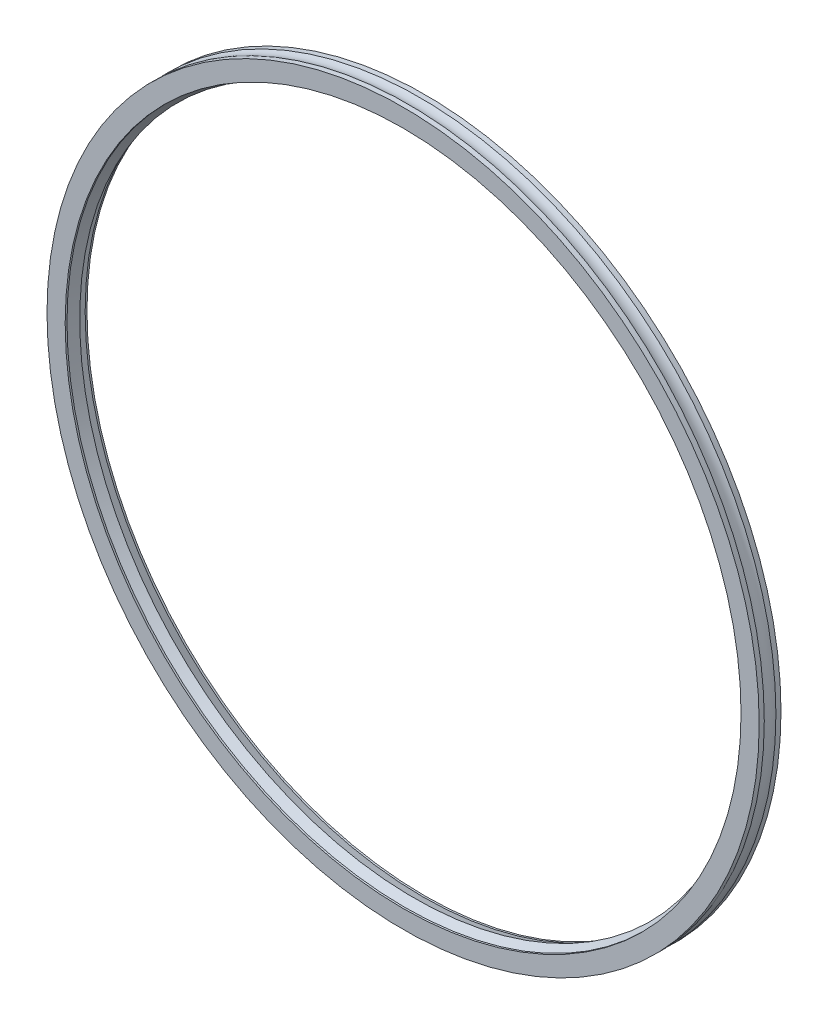
ISO-10303-21;
HEADER;
FILE_DESCRIPTION(('STEP AP214'),'2;1');
FILE_NAME('part.step','',(''),(''),'','','');
FILE_SCHEMA(('AUTOMOTIVE_DESIGN { 1 0 10303 214 1 1 1 1 }'));
ENDSEC;
DATA;
#1=APPLICATION_CONTEXT('core data for automotive mechanical design processes');
#2=APPLICATION_PROTOCOL_DEFINITION('international standard','automotive_design',2000,#1);
#3=PRODUCT_CONTEXT('',#1,'mechanical');
#4=PRODUCT('Part','Part','',(#3));
#5=PRODUCT_RELATED_PRODUCT_CATEGORY('part','',(#4));
#6=PRODUCT_DEFINITION_FORMATION('','',#4);
#7=PRODUCT_DEFINITION_CONTEXT('part definition',#1,'design');
#8=PRODUCT_DEFINITION('design','',#6,#7);
#9=PRODUCT_DEFINITION_SHAPE('','',#8);
#10=(LENGTH_UNIT() NAMED_UNIT(*) SI_UNIT(.MILLI.,.METRE.));
#11=(NAMED_UNIT(*) PLANE_ANGLE_UNIT() SI_UNIT($,.RADIAN.));
#12=(NAMED_UNIT(*) SI_UNIT($,.STERADIAN.) SOLID_ANGLE_UNIT());
#13=UNCERTAINTY_MEASURE_WITH_UNIT(LENGTH_MEASURE(1.E-05),#10,'distance_accuracy_value','');
#14=(GEOMETRIC_REPRESENTATION_CONTEXT(3) GLOBAL_UNCERTAINTY_ASSIGNED_CONTEXT((#13)) GLOBAL_UNIT_ASSIGNED_CONTEXT((#10,
#11,#12)) REPRESENTATION_CONTEXT('',''));
#15=CARTESIAN_POINT('',(0.,0.,0.));
#16=DIRECTION('',(0.,0.,1.));
#17=DIRECTION('',(1.,0.,0.));
#18=AXIS2_PLACEMENT_3D('',#15,#16,#17);
#19=CARTESIAN_POINT('',(0.,0.,0.));
#20=DIRECTION('',(0.,0.,1.));
#21=DIRECTION('',(1.,0.,0.));
#22=AXIS2_PLACEMENT_3D('',#19,#20,#21);
#23=TOROIDAL_SURFACE('',#22,50.8330302779823,2.);
#24=CARTESIAN_POINT('',(0.,0.,0.8));
#25=DIRECTION('',(0.,0.,1.));
#26=DIRECTION('',(1.,0.,0.));
#27=AXIS2_PLACEMENT_3D('',#24,#25,#26);
#28=CIRCLE('',#27,49.);
#29=CARTESIAN_POINT('',(49.,0.,0.8));
#30=VERTEX_POINT('',#29);
#31=EDGE_CURVE('E10',#30,#30,#28,.T.);
#32=ORIENTED_EDGE('',*,*,#31,.F.);
#33=EDGE_LOOP('',(#32));
#34=FACE_BOUND('',#33,.T.);
#35=CARTESIAN_POINT('',(0.,0.,-0.8));
#36=DIRECTION('',(0.,0.,1.));
#37=DIRECTION('',(1.,0.,0.));
#38=AXIS2_PLACEMENT_3D('',#35,#36,#37);
#39=CIRCLE('',#38,49.);
#40=CARTESIAN_POINT('',(49.,0.,-0.8));
#41=VERTEX_POINT('',#40);
#42=EDGE_CURVE('E68',#41,#41,#39,.T.);
#43=ORIENTED_EDGE('',*,*,#42,.T.);
#44=EDGE_LOOP('',(#43));
#45=FACE_BOUND('',#44,.T.);
#46=ADVANCED_FACE('F37',(#34,#45),#23,.F.);
#47=CARTESIAN_POINT('',(0.,0.,0.));
#48=DIRECTION('',(0.,0.,1.));
#49=DIRECTION('',(1.,0.,0.));
#50=AXIS2_PLACEMENT_3D('',#47,#48,#49);
#51=CYLINDRICAL_SURFACE('',#50,49.);
#52=CARTESIAN_POINT('',(0.,0.,1.5));
#53=DIRECTION('',(0.,0.,1.));
#54=DIRECTION('',(1.,0.,0.));
#55=AXIS2_PLACEMENT_3D('',#52,#53,#54);
#56=CIRCLE('',#55,49.);
#57=CARTESIAN_POINT('',(49.,0.,1.5));
#58=VERTEX_POINT('',#57);
#59=EDGE_CURVE('E43',#58,#58,#56,.T.);
#60=ORIENTED_EDGE('',*,*,#59,.F.);
#61=EDGE_LOOP('',(#60));
#62=FACE_BOUND('',#61,.T.);
#63=ORIENTED_EDGE('',*,*,#31,.T.);
#64=EDGE_LOOP('',(#63));
#65=FACE_BOUND('',#64,.T.);
#66=ADVANCED_FACE('F111',(#62,#65),#51,.T.);
#67=CARTESIAN_POINT('',(0.,49.,1.5));
#68=DIRECTION('',(0.,0.,-1.));
#69=DIRECTION('',(-1.,0.,0.));
#70=AXIS2_PLACEMENT_3D('',#67,#68,#69);
#71=PLANE('',#70);
#72=CARTESIAN_POINT('',(0.,0.,1.5));
#73=DIRECTION('',(0.,0.,1.));
#74=DIRECTION('',(1.,0.,0.));
#75=AXIS2_PLACEMENT_3D('',#72,#73,#74);
#76=CIRCLE('',#75,46.5);
#77=CARTESIAN_POINT('',(46.5,0.,1.5));
#78=VERTEX_POINT('',#77);
#79=EDGE_CURVE('E47',#78,#78,#76,.T.);
#80=ORIENTED_EDGE('',*,*,#79,.F.);
#81=EDGE_LOOP('',(#80));
#82=FACE_BOUND('',#81,.T.);
#83=ORIENTED_EDGE('',*,*,#59,.T.);
#84=EDGE_LOOP('',(#83));
#85=FACE_BOUND('',#84,.T.);
#86=ADVANCED_FACE('F106',(#82,#85),#71,.F.);
#87=CARTESIAN_POINT('',(0.,0.,0.));
#88=DIRECTION('',(0.,0.,1.));
#89=DIRECTION('',(1.,0.,0.));
#90=AXIS2_PLACEMENT_3D('',#87,#88,#89);
#91=CYLINDRICAL_SURFACE('',#90,46.5);
#92=CARTESIAN_POINT('',(0.,0.,1.25));
#93=DIRECTION('',(0.,0.,1.));
#94=DIRECTION('',(1.,0.,0.));
#95=AXIS2_PLACEMENT_3D('',#92,#93,#94);
#96=CIRCLE('',#95,46.5);
#97=CARTESIAN_POINT('',(46.5,0.,1.25));
#98=VERTEX_POINT('',#97);
#99=EDGE_CURVE('E51',#98,#98,#96,.T.);
#100=ORIENTED_EDGE('',*,*,#99,.F.);
#101=EDGE_LOOP('',(#100));
#102=FACE_BOUND('',#101,.T.);
#103=ORIENTED_EDGE('',*,*,#79,.T.);
#104=EDGE_LOOP('',(#103));
#105=FACE_BOUND('',#104,.T.);
#106=ADVANCED_FACE('F100',(#102,#105),#91,.F.);
#107=CARTESIAN_POINT('',(0.,0.,1.25));
#108=DIRECTION('',(0.,0.,1.));
#109=DIRECTION('',(1.,0.,0.));
#110=AXIS2_PLACEMENT_3D('',#107,#108,#109);
#111=CONICAL_SURFACE('',#110,46.5,0.380506377112365);
#112=CARTESIAN_POINT('',(0.,0.,0.));
#113=DIRECTION('',(0.,0.,1.));
#114=DIRECTION('',(1.,0.,0.));
#115=AXIS2_PLACEMENT_3D('',#112,#113,#114);
#116=CIRCLE('',#115,46.);
#117=CARTESIAN_POINT('',(46.,0.,0.));
#118=VERTEX_POINT('',#117);
#119=EDGE_CURVE('E56',#118,#118,#116,.T.);
#120=ORIENTED_EDGE('',*,*,#119,.F.);
#121=EDGE_LOOP('',(#120));
#122=FACE_BOUND('',#121,.T.);
#123=ORIENTED_EDGE('',*,*,#99,.T.);
#124=EDGE_LOOP('',(#123));
#125=FACE_BOUND('',#124,.T.);
#126=ADVANCED_FACE('F94',(#122,#125),#111,.F.);
#127=CARTESIAN_POINT('',(0.,0.,0.));
#128=DIRECTION('',(0.,0.,-1.));
#129=DIRECTION('',(-1.,0.,0.));
#130=AXIS2_PLACEMENT_3D('',#127,#128,#129);
#131=CONICAL_SURFACE('',#130,46.,0.380506377112365);
#132=CARTESIAN_POINT('',(0.,0.,-1.25));
#133=DIRECTION('',(0.,0.,1.));
#134=DIRECTION('',(1.,0.,0.));
#135=AXIS2_PLACEMENT_3D('',#132,#133,#134);
#136=CIRCLE('',#135,46.5);
#137=CARTESIAN_POINT('',(46.5,0.,-1.25));
#138=VERTEX_POINT('',#137);
#139=EDGE_CURVE('E59',#138,#138,#136,.T.);
#140=ORIENTED_EDGE('',*,*,#139,.F.);
#141=EDGE_LOOP('',(#140));
#142=FACE_BOUND('',#141,.T.);
#143=ORIENTED_EDGE('',*,*,#119,.T.);
#144=EDGE_LOOP('',(#143));
#145=FACE_BOUND('',#144,.T.);
#146=ADVANCED_FACE('F88',(#142,#145),#131,.F.);
#147=CARTESIAN_POINT('',(0.,0.,0.));
#148=DIRECTION('',(0.,0.,1.));
#149=DIRECTION('',(1.,0.,0.));
#150=AXIS2_PLACEMENT_3D('',#147,#148,#149);
#151=CYLINDRICAL_SURFACE('',#150,46.5);
#152=CARTESIAN_POINT('',(0.,0.,-1.5));
#153=DIRECTION('',(0.,0.,1.));
#154=DIRECTION('',(1.,0.,0.));
#155=AXIS2_PLACEMENT_3D('',#152,#153,#154);
#156=CIRCLE('',#155,46.5);
#157=CARTESIAN_POINT('',(46.5,0.,-1.5));
#158=VERTEX_POINT('',#157);
#159=EDGE_CURVE('E62',#158,#158,#156,.T.);
#160=ORIENTED_EDGE('',*,*,#159,.F.);
#161=EDGE_LOOP('',(#160));
#162=FACE_BOUND('',#161,.T.);
#163=ORIENTED_EDGE('',*,*,#139,.T.);
#164=EDGE_LOOP('',(#163));
#165=FACE_BOUND('',#164,.T.);
#166=ADVANCED_FACE('F82',(#162,#165),#151,.F.);
#167=CARTESIAN_POINT('',(0.,49.,-1.5));
#168=DIRECTION('',(0.,0.,1.));
#169=DIRECTION('',(1.,0.,0.));
#170=AXIS2_PLACEMENT_3D('',#167,#168,#169);
#171=PLANE('',#170);
#172=CARTESIAN_POINT('',(0.,0.,-1.5));
#173=DIRECTION('',(0.,0.,1.));
#174=DIRECTION('',(1.,0.,0.));
#175=AXIS2_PLACEMENT_3D('',#172,#173,#174);
#176=CIRCLE('',#175,49.);
#177=CARTESIAN_POINT('',(49.,0.,-1.5));
#178=VERTEX_POINT('',#177);
#179=EDGE_CURVE('E65',#178,#178,#176,.T.);
#180=ORIENTED_EDGE('',*,*,#179,.F.);
#181=EDGE_LOOP('',(#180));
#182=FACE_BOUND('',#181,.T.);
#183=ORIENTED_EDGE('',*,*,#159,.T.);
#184=EDGE_LOOP('',(#183));
#185=FACE_BOUND('',#184,.T.);
#186=ADVANCED_FACE('F76',(#182,#185),#171,.F.);
#187=CARTESIAN_POINT('',(0.,0.,0.));
#188=DIRECTION('',(0.,0.,1.));
#189=DIRECTION('',(1.,0.,0.));
#190=AXIS2_PLACEMENT_3D('',#187,#188,#189);
#191=CYLINDRICAL_SURFACE('',#190,49.);
#192=ORIENTED_EDGE('',*,*,#42,.F.);
#193=EDGE_LOOP('',(#192));
#194=FACE_BOUND('',#193,.T.);
#195=ORIENTED_EDGE('',*,*,#179,.T.);
#196=EDGE_LOOP('',(#195));
#197=FACE_BOUND('',#196,.T.);
#198=ADVANCED_FACE('F73',(#194,#197),#191,.T.);
#199=CLOSED_SHELL('',(#46,#66,#86,#106,#126,#146,#166,#186,#198));
#200=MANIFOLD_SOLID_BREP('B2',#199);
#201=ADVANCED_BREP_SHAPE_REPRESENTATION('',(#18,#200),#14);
#202=SHAPE_DEFINITION_REPRESENTATION(#9,#201);
ENDSEC;
END-ISO-10303-21;
